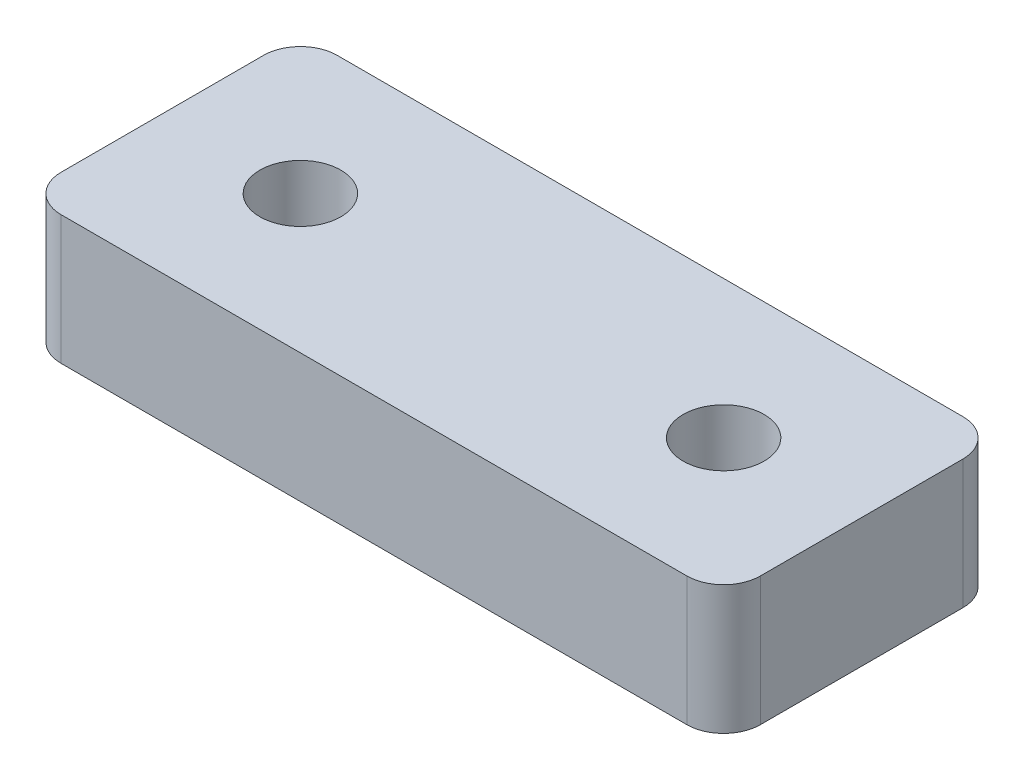
ISO-10303-21;
HEADER;
FILE_DESCRIPTION(('STEP AP214'),'2;1');
FILE_NAME('part.step','',(''),(''),'','','');
FILE_SCHEMA(('AUTOMOTIVE_DESIGN { 1 0 10303 214 1 1 1 1 }'));
ENDSEC;
DATA;
#1=APPLICATION_CONTEXT('core data for automotive mechanical design processes');
#2=APPLICATION_PROTOCOL_DEFINITION('international standard','automotive_design',2000,#1);
#3=PRODUCT_CONTEXT('',#1,'mechanical');
#4=PRODUCT('Part','Part','',(#3));
#5=PRODUCT_RELATED_PRODUCT_CATEGORY('part','',(#4));
#6=PRODUCT_DEFINITION_FORMATION('','',#4);
#7=PRODUCT_DEFINITION_CONTEXT('part definition',#1,'design');
#8=PRODUCT_DEFINITION('design','',#6,#7);
#9=PRODUCT_DEFINITION_SHAPE('','',#8);
#10=(LENGTH_UNIT() NAMED_UNIT(*) SI_UNIT(.MILLI.,.METRE.));
#11=(NAMED_UNIT(*) PLANE_ANGLE_UNIT() SI_UNIT($,.RADIAN.));
#12=(NAMED_UNIT(*) SI_UNIT($,.STERADIAN.) SOLID_ANGLE_UNIT());
#13=UNCERTAINTY_MEASURE_WITH_UNIT(LENGTH_MEASURE(1.E-05),#10,'distance_accuracy_value','');
#14=(GEOMETRIC_REPRESENTATION_CONTEXT(3) GLOBAL_UNCERTAINTY_ASSIGNED_CONTEXT((#13)) GLOBAL_UNIT_ASSIGNED_CONTEXT((#10,
#11,#12)) REPRESENTATION_CONTEXT('',''));
#15=CARTESIAN_POINT('',(0.,0.,0.));
#16=DIRECTION('',(0.,0.,1.));
#17=DIRECTION('',(1.,0.,0.));
#18=AXIS2_PLACEMENT_3D('',#15,#16,#17);
#19=CARTESIAN_POINT('',(0.,7.,0.));
#20=DIRECTION('',(0.,1.,0.));
#21=DIRECTION('',(0.,0.,1.));
#22=AXIS2_PLACEMENT_3D('',#19,#20,#21);
#23=PLANE('',#22);
#24=CARTESIAN_POINT('',(-11.5,7.,0.));
#25=DIRECTION('',(0.,1.,0.));
#26=DIRECTION('',(0.,0.,1.));
#27=AXIS2_PLACEMENT_3D('',#24,#25,#26);
#28=CIRCLE('',#27,2.2);
#29=CARTESIAN_POINT('',(-11.5,7.,2.2));
#30=VERTEX_POINT('',#29);
#31=EDGE_CURVE('E170',#30,#30,#28,.T.);
#32=ORIENTED_EDGE('',*,*,#31,.F.);
#33=EDGE_LOOP('',(#32));
#34=FACE_BOUND('',#33,.T.);
#35=DIRECTION('',(0.,0.,1.));
#36=VECTOR('',#35,1.);
#37=CARTESIAN_POINT('',(-19.,7.,-7.5));
#38=LINE('',#37,#36);
#39=CARTESIAN_POINT('',(-19.,7.,-5.5));
#40=VERTEX_POINT('',#39);
#41=CARTESIAN_POINT('',(-19.,7.,5.5));
#42=VERTEX_POINT('',#41);
#43=EDGE_CURVE('E177',#40,#42,#38,.T.);
#44=ORIENTED_EDGE('',*,*,#43,.T.);
#45=CARTESIAN_POINT('',(-17.,7.,5.5));
#46=DIRECTION('',(0.,1.,0.));
#47=DIRECTION('',(0.,0.,1.));
#48=AXIS2_PLACEMENT_3D('',#45,#46,#47);
#49=CIRCLE('',#48,2.);
#50=CARTESIAN_POINT('',(-17.,7.,7.5));
#51=VERTEX_POINT('',#50);
#52=EDGE_CURVE('E154',#42,#51,#49,.T.);
#53=ORIENTED_EDGE('',*,*,#52,.T.);
#54=DIRECTION('',(1.,0.,0.));
#55=VECTOR('',#54,1.);
#56=CARTESIAN_POINT('',(-19.,7.,7.5));
#57=LINE('',#56,#55);
#58=CARTESIAN_POINT('',(17.,7.,7.5));
#59=VERTEX_POINT('',#58);
#60=EDGE_CURVE('E125',#51,#59,#57,.T.);
#61=ORIENTED_EDGE('',*,*,#60,.T.);
#62=CARTESIAN_POINT('',(17.,7.,5.5));
#63=DIRECTION('',(0.,1.,0.));
#64=DIRECTION('',(0.,0.,1.));
#65=AXIS2_PLACEMENT_3D('',#62,#63,#64);
#66=CIRCLE('',#65,2.);
#67=CARTESIAN_POINT('',(19.,7.,5.5));
#68=VERTEX_POINT('',#67);
#69=EDGE_CURVE('E149',#59,#68,#66,.T.);
#70=ORIENTED_EDGE('',*,*,#69,.T.);
#71=DIRECTION('',(0.,0.,-1.));
#72=VECTOR('',#71,1.);
#73=CARTESIAN_POINT('',(19.,7.,-7.5));
#74=LINE('',#73,#72);
#75=CARTESIAN_POINT('',(19.,7.,-5.5));
#76=VERTEX_POINT('',#75);
#77=EDGE_CURVE('E132',#68,#76,#74,.T.);
#78=ORIENTED_EDGE('',*,*,#77,.T.);
#79=CARTESIAN_POINT('',(17.,7.,-5.5));
#80=DIRECTION('',(0.,1.,0.));
#81=DIRECTION('',(0.,0.,1.));
#82=AXIS2_PLACEMENT_3D('',#79,#80,#81);
#83=CIRCLE('',#82,2.);
#84=CARTESIAN_POINT('',(17.,7.,-7.5));
#85=VERTEX_POINT('',#84);
#86=EDGE_CURVE('E61',#76,#85,#83,.T.);
#87=ORIENTED_EDGE('',*,*,#86,.T.);
#88=DIRECTION('',(-1.,0.,0.));
#89=VECTOR('',#88,1.);
#90=CARTESIAN_POINT('',(-19.,7.,-7.5));
#91=LINE('',#90,#89);
#92=CARTESIAN_POINT('',(-17.,7.,-7.5));
#93=VERTEX_POINT('',#92);
#94=EDGE_CURVE('E135',#85,#93,#91,.T.);
#95=ORIENTED_EDGE('',*,*,#94,.T.);
#96=CARTESIAN_POINT('',(-17.,7.,-5.5));
#97=DIRECTION('',(0.,1.,0.));
#98=DIRECTION('',(0.,0.,1.));
#99=AXIS2_PLACEMENT_3D('',#96,#97,#98);
#100=CIRCLE('',#99,2.);
#101=EDGE_CURVE('E152',#93,#40,#100,.T.);
#102=ORIENTED_EDGE('',*,*,#101,.T.);
#103=EDGE_LOOP('',(#44,#53,#61,#70,#78,#87,#95,#102));
#104=FACE_BOUND('',#103,.T.);
#105=CARTESIAN_POINT('',(11.5,7.,0.));
#106=DIRECTION('',(0.,1.,0.));
#107=DIRECTION('',(0.,0.,-1.));
#108=AXIS2_PLACEMENT_3D('',#105,#106,#107);
#109=CIRCLE('',#108,2.2);
#110=CARTESIAN_POINT('',(11.5,7.,-2.2));
#111=VERTEX_POINT('',#110);
#112=EDGE_CURVE('E182',#111,#111,#109,.T.);
#113=ORIENTED_EDGE('',*,*,#112,.F.);
#114=EDGE_LOOP('',(#113));
#115=FACE_BOUND('',#114,.T.);
#116=ADVANCED_FACE('F39',(#34,#104,#115),#23,.T.);
#117=CARTESIAN_POINT('',(0.,0.,0.));
#118=DIRECTION('',(0.,1.,0.));
#119=DIRECTION('',(0.,0.,1.));
#120=AXIS2_PLACEMENT_3D('',#117,#118,#119);
#121=PLANE('',#120);
#122=DIRECTION('',(1.,0.,0.));
#123=VECTOR('',#122,1.);
#124=CARTESIAN_POINT('',(-19.,0.,7.5));
#125=LINE('',#124,#123);
#126=CARTESIAN_POINT('',(-17.,0.,7.5));
#127=VERTEX_POINT('',#126);
#128=CARTESIAN_POINT('',(17.,0.,7.5));
#129=VERTEX_POINT('',#128);
#130=EDGE_CURVE('E122',#127,#129,#125,.T.);
#131=ORIENTED_EDGE('',*,*,#130,.F.);
#132=CARTESIAN_POINT('',(-17.,0.,5.5));
#133=DIRECTION('',(0.,1.,0.));
#134=DIRECTION('',(0.,0.,1.));
#135=AXIS2_PLACEMENT_3D('',#132,#133,#134);
#136=CIRCLE('',#135,2.);
#137=CARTESIAN_POINT('',(-19.,0.,5.5));
#138=VERTEX_POINT('',#137);
#139=EDGE_CURVE('E105',#127,#138,#136,.F.);
#140=ORIENTED_EDGE('',*,*,#139,.T.);
#141=DIRECTION('',(0.,0.,1.));
#142=VECTOR('',#141,1.);
#143=CARTESIAN_POINT('',(-19.,0.,-7.5));
#144=LINE('',#143,#142);
#145=CARTESIAN_POINT('',(-19.,0.,-5.5));
#146=VERTEX_POINT('',#145);
#147=EDGE_CURVE('E133',#146,#138,#144,.T.);
#148=ORIENTED_EDGE('',*,*,#147,.F.);
#149=CARTESIAN_POINT('',(-17.,0.,-5.5));
#150=DIRECTION('',(0.,1.,0.));
#151=DIRECTION('',(0.,0.,1.));
#152=AXIS2_PLACEMENT_3D('',#149,#150,#151);
#153=CIRCLE('',#152,2.);
#154=CARTESIAN_POINT('',(-17.,0.,-7.5));
#155=VERTEX_POINT('',#154);
#156=EDGE_CURVE('E116',#146,#155,#153,.F.);
#157=ORIENTED_EDGE('',*,*,#156,.T.);
#158=DIRECTION('',(-1.,0.,0.));
#159=VECTOR('',#158,1.);
#160=CARTESIAN_POINT('',(-19.,0.,-7.5));
#161=LINE('',#160,#159);
#162=CARTESIAN_POINT('',(17.,0.,-7.5));
#163=VERTEX_POINT('',#162);
#164=EDGE_CURVE('E137',#163,#155,#161,.T.);
#165=ORIENTED_EDGE('',*,*,#164,.F.);
#166=CARTESIAN_POINT('',(17.,0.,-5.5));
#167=DIRECTION('',(0.,1.,0.));
#168=DIRECTION('',(0.,0.,1.));
#169=AXIS2_PLACEMENT_3D('',#166,#167,#168);
#170=CIRCLE('',#169,2.);
#171=CARTESIAN_POINT('',(19.,0.,-5.5));
#172=VERTEX_POINT('',#171);
#173=EDGE_CURVE('E143',#163,#172,#170,.F.);
#174=ORIENTED_EDGE('',*,*,#173,.T.);
#175=DIRECTION('',(0.,0.,-1.));
#176=VECTOR('',#175,1.);
#177=CARTESIAN_POINT('',(19.,0.,-7.5));
#178=LINE('',#177,#176);
#179=CARTESIAN_POINT('',(19.,0.,5.5));
#180=VERTEX_POINT('',#179);
#181=EDGE_CURVE('E165',#180,#172,#178,.T.);
#182=ORIENTED_EDGE('',*,*,#181,.F.);
#183=CARTESIAN_POINT('',(17.,0.,5.5));
#184=DIRECTION('',(0.,1.,0.));
#185=DIRECTION('',(0.,0.,1.));
#186=AXIS2_PLACEMENT_3D('',#183,#184,#185);
#187=CIRCLE('',#186,2.);
#188=EDGE_CURVE('E126',#180,#129,#187,.F.);
#189=ORIENTED_EDGE('',*,*,#188,.T.);
#190=EDGE_LOOP('',(#131,#140,#148,#157,#165,#174,#182,#189));
#191=FACE_BOUND('',#190,.T.);
#192=CARTESIAN_POINT('',(-11.5,0.,0.));
#193=DIRECTION('',(0.,1.,0.));
#194=DIRECTION('',(0.,0.,1.));
#195=AXIS2_PLACEMENT_3D('',#192,#193,#194);
#196=CIRCLE('',#195,2.2);
#197=CARTESIAN_POINT('',(-11.5,0.,2.2));
#198=VERTEX_POINT('',#197);
#199=EDGE_CURVE('E173',#198,#198,#196,.T.);
#200=ORIENTED_EDGE('',*,*,#199,.T.);
#201=EDGE_LOOP('',(#200));
#202=FACE_BOUND('',#201,.T.);
#203=CARTESIAN_POINT('',(11.5,0.,0.));
#204=DIRECTION('',(0.,1.,0.));
#205=DIRECTION('',(0.,0.,-1.));
#206=AXIS2_PLACEMENT_3D('',#203,#204,#205);
#207=CIRCLE('',#206,2.2);
#208=CARTESIAN_POINT('',(11.5,0.,-2.2));
#209=VERTEX_POINT('',#208);
#210=EDGE_CURVE('E184',#209,#209,#207,.T.);
#211=ORIENTED_EDGE('',*,*,#210,.T.);
#212=EDGE_LOOP('',(#211));
#213=FACE_BOUND('',#212,.T.);
#214=ADVANCED_FACE('F129',(#191,#202,#213),#121,.F.);
#215=CARTESIAN_POINT('',(19.,7.,-7.5));
#216=DIRECTION('',(-1.,0.,0.));
#217=DIRECTION('',(0.,0.,1.));
#218=AXIS2_PLACEMENT_3D('',#215,#216,#217);
#219=PLANE('',#218);
#220=ORIENTED_EDGE('',*,*,#181,.T.);
#221=DIRECTION('',(0.,-1.,0.));
#222=VECTOR('',#221,1.);
#223=CARTESIAN_POINT('',(19.,7.,-5.5));
#224=LINE('',#223,#222);
#225=EDGE_CURVE('E11',#172,#76,#224,.F.);
#226=ORIENTED_EDGE('',*,*,#225,.T.);
#227=ORIENTED_EDGE('',*,*,#77,.F.);
#228=DIRECTION('',(0.,-1.,0.));
#229=VECTOR('',#228,1.);
#230=CARTESIAN_POINT('',(19.,7.,5.5));
#231=LINE('',#230,#229);
#232=EDGE_CURVE('E47',#68,#180,#231,.T.);
#233=ORIENTED_EDGE('',*,*,#232,.T.);
#234=EDGE_LOOP('',(#220,#226,#227,#233));
#235=FACE_BOUND('',#234,.T.);
#236=ADVANCED_FACE('F164',(#235),#219,.F.);
#237=CARTESIAN_POINT('',(-19.,7.,-7.5));
#238=DIRECTION('',(0.,0.,1.));
#239=DIRECTION('',(1.,0.,0.));
#240=AXIS2_PLACEMENT_3D('',#237,#238,#239);
#241=PLANE('',#240);
#242=ORIENTED_EDGE('',*,*,#164,.T.);
#243=DIRECTION('',(0.,-1.,0.));
#244=VECTOR('',#243,1.);
#245=CARTESIAN_POINT('',(-17.,7.,-7.5));
#246=LINE('',#245,#244);
#247=EDGE_CURVE('E54',#155,#93,#246,.F.);
#248=ORIENTED_EDGE('',*,*,#247,.T.);
#249=ORIENTED_EDGE('',*,*,#94,.F.);
#250=DIRECTION('',(0.,-1.,0.));
#251=VECTOR('',#250,1.);
#252=CARTESIAN_POINT('',(17.,7.,-7.5));
#253=LINE('',#252,#251);
#254=EDGE_CURVE('E156',#85,#163,#253,.T.);
#255=ORIENTED_EDGE('',*,*,#254,.T.);
#256=EDGE_LOOP('',(#242,#248,#249,#255));
#257=FACE_BOUND('',#256,.T.);
#258=ADVANCED_FACE('F211',(#257),#241,.F.);
#259=CARTESIAN_POINT('',(-19.,7.,-7.5));
#260=DIRECTION('',(1.,0.,0.));
#261=DIRECTION('',(0.,0.,-1.));
#262=AXIS2_PLACEMENT_3D('',#259,#260,#261);
#263=PLANE('',#262);
#264=ORIENTED_EDGE('',*,*,#147,.T.);
#265=DIRECTION('',(0.,-1.,0.));
#266=VECTOR('',#265,1.);
#267=CARTESIAN_POINT('',(-19.,7.,5.5));
#268=LINE('',#267,#266);
#269=EDGE_CURVE('E110',#138,#42,#268,.F.);
#270=ORIENTED_EDGE('',*,*,#269,.T.);
#271=ORIENTED_EDGE('',*,*,#43,.F.);
#272=DIRECTION('',(0.,-1.,0.));
#273=VECTOR('',#272,1.);
#274=CARTESIAN_POINT('',(-19.,7.,-5.5));
#275=LINE('',#274,#273);
#276=EDGE_CURVE('E115',#40,#146,#275,.T.);
#277=ORIENTED_EDGE('',*,*,#276,.T.);
#278=EDGE_LOOP('',(#264,#270,#271,#277));
#279=FACE_BOUND('',#278,.T.);
#280=ADVANCED_FACE('F208',(#279),#263,.F.);
#281=CARTESIAN_POINT('',(-19.,7.,7.5));
#282=DIRECTION('',(0.,0.,-1.));
#283=DIRECTION('',(-1.,0.,0.));
#284=AXIS2_PLACEMENT_3D('',#281,#282,#283);
#285=PLANE('',#284);
#286=ORIENTED_EDGE('',*,*,#60,.F.);
#287=DIRECTION('',(0.,-1.,0.));
#288=VECTOR('',#287,1.);
#289=CARTESIAN_POINT('',(-17.,7.,7.5));
#290=LINE('',#289,#288);
#291=EDGE_CURVE('E109',#51,#127,#290,.T.);
#292=ORIENTED_EDGE('',*,*,#291,.T.);
#293=ORIENTED_EDGE('',*,*,#130,.T.);
#294=DIRECTION('',(0.,-1.,0.));
#295=VECTOR('',#294,1.);
#296=CARTESIAN_POINT('',(17.,7.,7.5));
#297=LINE('',#296,#295);
#298=EDGE_CURVE('E127',#129,#59,#297,.F.);
#299=ORIENTED_EDGE('',*,*,#298,.T.);
#300=EDGE_LOOP('',(#286,#292,#293,#299));
#301=FACE_BOUND('',#300,.T.);
#302=ADVANCED_FACE('F121',(#301),#285,.F.);
#303=CARTESIAN_POINT('',(-11.5,7.,0.));
#304=DIRECTION('',(0.,-1.,0.));
#305=DIRECTION('',(0.,0.,-1.));
#306=AXIS2_PLACEMENT_3D('',#303,#304,#305);
#307=CYLINDRICAL_SURFACE('',#306,2.2);
#308=ORIENTED_EDGE('',*,*,#31,.T.);
#309=EDGE_LOOP('',(#308));
#310=FACE_BOUND('',#309,.T.);
#311=ORIENTED_EDGE('',*,*,#199,.F.);
#312=EDGE_LOOP('',(#311));
#313=FACE_BOUND('',#312,.T.);
#314=ADVANCED_FACE('F203',(#310,#313),#307,.F.);
#315=CARTESIAN_POINT('',(11.5,7.,0.));
#316=DIRECTION('',(0.,-1.,0.));
#317=DIRECTION('',(0.,0.,-1.));
#318=AXIS2_PLACEMENT_3D('',#315,#316,#317);
#319=CYLINDRICAL_SURFACE('',#318,2.2);
#320=ORIENTED_EDGE('',*,*,#112,.T.);
#321=EDGE_LOOP('',(#320));
#322=FACE_BOUND('',#321,.T.);
#323=ORIENTED_EDGE('',*,*,#210,.F.);
#324=EDGE_LOOP('',(#323));
#325=FACE_BOUND('',#324,.T.);
#326=ADVANCED_FACE('F190',(#322,#325),#319,.F.);
#327=CARTESIAN_POINT('',(-17.,7.,5.5));
#328=DIRECTION('',(0.,-1.,0.));
#329=DIRECTION('',(0.,0.,-1.));
#330=AXIS2_PLACEMENT_3D('',#327,#328,#329);
#331=CYLINDRICAL_SURFACE('',#330,2.);
#332=ORIENTED_EDGE('',*,*,#52,.F.);
#333=ORIENTED_EDGE('',*,*,#269,.F.);
#334=ORIENTED_EDGE('',*,*,#139,.F.);
#335=ORIENTED_EDGE('',*,*,#291,.F.);
#336=EDGE_LOOP('',(#332,#333,#334,#335));
#337=FACE_BOUND('',#336,.T.);
#338=ADVANCED_FACE('F108',(#337),#331,.T.);
#339=CARTESIAN_POINT('',(-17.,7.,-5.5));
#340=DIRECTION('',(0.,-1.,0.));
#341=DIRECTION('',(0.,0.,-1.));
#342=AXIS2_PLACEMENT_3D('',#339,#340,#341);
#343=CYLINDRICAL_SURFACE('',#342,2.);
#344=ORIENTED_EDGE('',*,*,#101,.F.);
#345=ORIENTED_EDGE('',*,*,#247,.F.);
#346=ORIENTED_EDGE('',*,*,#156,.F.);
#347=ORIENTED_EDGE('',*,*,#276,.F.);
#348=EDGE_LOOP('',(#344,#345,#346,#347));
#349=FACE_BOUND('',#348,.T.);
#350=ADVANCED_FACE('F219',(#349),#343,.T.);
#351=CARTESIAN_POINT('',(17.,7.,-5.5));
#352=DIRECTION('',(0.,-1.,0.));
#353=DIRECTION('',(0.,0.,-1.));
#354=AXIS2_PLACEMENT_3D('',#351,#352,#353);
#355=CYLINDRICAL_SURFACE('',#354,2.);
#356=ORIENTED_EDGE('',*,*,#86,.F.);
#357=ORIENTED_EDGE('',*,*,#225,.F.);
#358=ORIENTED_EDGE('',*,*,#173,.F.);
#359=ORIENTED_EDGE('',*,*,#254,.F.);
#360=EDGE_LOOP('',(#356,#357,#358,#359));
#361=FACE_BOUND('',#360,.T.);
#362=ADVANCED_FACE('F221',(#361),#355,.T.);
#363=CARTESIAN_POINT('',(17.,7.,5.5));
#364=DIRECTION('',(0.,-1.,0.));
#365=DIRECTION('',(0.,0.,-1.));
#366=AXIS2_PLACEMENT_3D('',#363,#364,#365);
#367=CYLINDRICAL_SURFACE('',#366,2.);
#368=ORIENTED_EDGE('',*,*,#69,.F.);
#369=ORIENTED_EDGE('',*,*,#298,.F.);
#370=ORIENTED_EDGE('',*,*,#188,.F.);
#371=ORIENTED_EDGE('',*,*,#232,.F.);
#372=EDGE_LOOP('',(#368,#369,#370,#371));
#373=FACE_BOUND('',#372,.T.);
#374=ADVANCED_FACE('F41',(#373),#367,.T.);
#375=CLOSED_SHELL('',(#116,#214,#236,#258,#280,#302,#314,#326,#338,#350,#362,#374));
#376=MANIFOLD_SOLID_BREP('B2',#375);
#377=ADVANCED_BREP_SHAPE_REPRESENTATION('',(#18,#376),#14);
#378=SHAPE_DEFINITION_REPRESENTATION(#9,#377);
ENDSEC;
END-ISO-10303-21;
